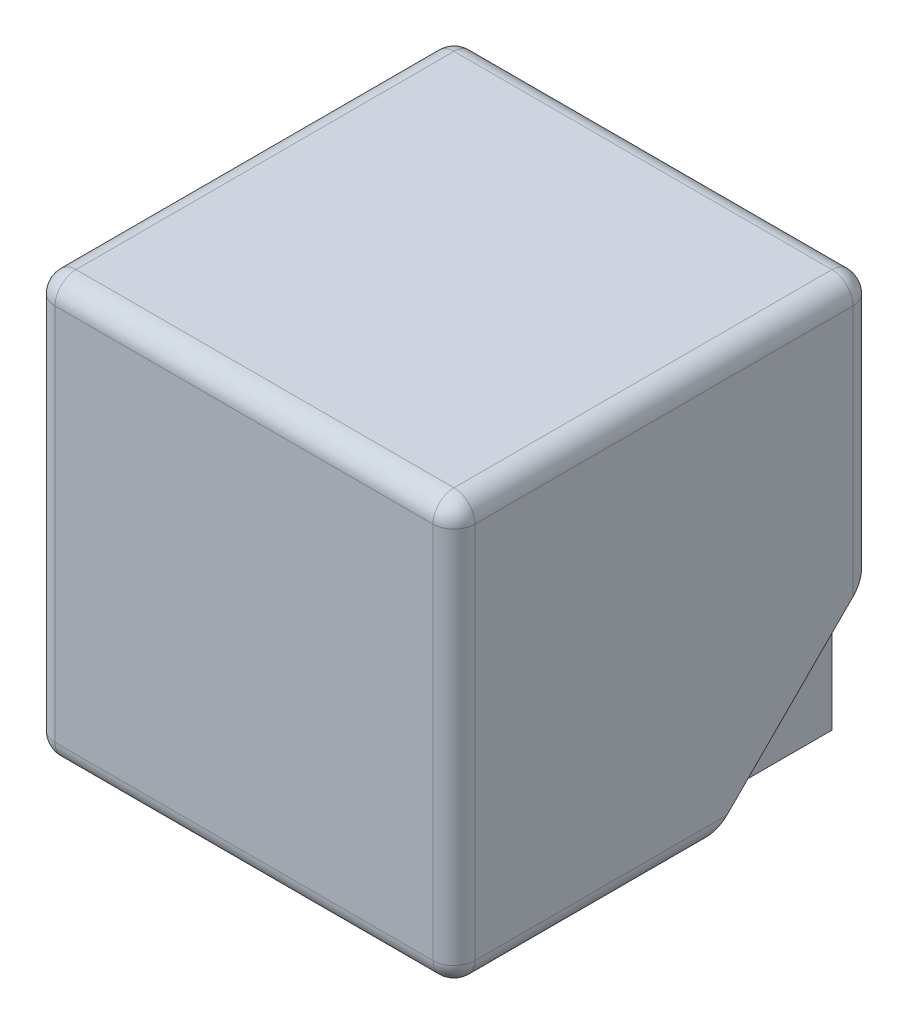
ISO-10303-21;
HEADER;
FILE_DESCRIPTION(('STEP AP214'),'2;1');
FILE_NAME('part.step','',(''),(''),'','','');
FILE_SCHEMA(('AUTOMOTIVE_DESIGN { 1 0 10303 214 1 1 1 1 }'));
ENDSEC;
DATA;
#1=APPLICATION_CONTEXT('core data for automotive mechanical design processes');
#2=APPLICATION_PROTOCOL_DEFINITION('international standard','automotive_design',2000,#1);
#3=PRODUCT_CONTEXT('',#1,'mechanical');
#4=PRODUCT('Part','Part','',(#3));
#5=PRODUCT_RELATED_PRODUCT_CATEGORY('part','',(#4));
#6=PRODUCT_DEFINITION_FORMATION('','',#4);
#7=PRODUCT_DEFINITION_CONTEXT('part definition',#1,'design');
#8=PRODUCT_DEFINITION('design','',#6,#7);
#9=PRODUCT_DEFINITION_SHAPE('','',#8);
#10=(LENGTH_UNIT() NAMED_UNIT(*) SI_UNIT(.MILLI.,.METRE.));
#11=(NAMED_UNIT(*) PLANE_ANGLE_UNIT() SI_UNIT($,.RADIAN.));
#12=(NAMED_UNIT(*) SI_UNIT($,.STERADIAN.) SOLID_ANGLE_UNIT());
#13=UNCERTAINTY_MEASURE_WITH_UNIT(LENGTH_MEASURE(1.E-05),#10,'distance_accuracy_value','');
#14=(GEOMETRIC_REPRESENTATION_CONTEXT(3) GLOBAL_UNCERTAINTY_ASSIGNED_CONTEXT((#13)) GLOBAL_UNIT_ASSIGNED_CONTEXT((#10,
#11,#12)) REPRESENTATION_CONTEXT('',''));
#15=CARTESIAN_POINT('',(0.,0.,0.));
#16=DIRECTION('',(0.,0.,1.));
#17=DIRECTION('',(1.,0.,0.));
#18=AXIS2_PLACEMENT_3D('',#15,#16,#17);
#19=CARTESIAN_POINT('',(-5.,-5.,10.));
#20=DIRECTION('',(1.,0.,0.));
#21=DIRECTION('',(0.,1.,0.));
#22=AXIS2_PLACEMENT_3D('',#19,#20,#21);
#23=PLANE('',#22);
#24=DIRECTION('',(0.,0.,-1.));
#25=VECTOR('',#24,1.);
#26=CARTESIAN_POINT('',(-5.,4.5,10.));
#27=LINE('',#26,#25);
#28=CARTESIAN_POINT('',(-5.,4.5,9.5));
#29=VERTEX_POINT('',#28);
#30=CARTESIAN_POINT('',(-5.,4.5,0.5));
#31=VERTEX_POINT('',#30);
#32=EDGE_CURVE('E262',#29,#31,#27,.T.);
#33=ORIENTED_EDGE('',*,*,#32,.T.);
#34=DIRECTION('',(0.,-1.,0.));
#35=VECTOR('',#34,1.);
#36=CARTESIAN_POINT('',(-5.,-0.999999999999985,0.5));
#37=LINE('',#36,#35);
#38=CARTESIAN_POINT('',(-5.,-1.49999999999999,0.500000000000001));
#39=VERTEX_POINT('',#38);
#40=EDGE_CURVE('E57',#31,#39,#37,.T.);
#41=ORIENTED_EDGE('',*,*,#40,.T.);
#42=DIRECTION('',(0.,-0.707106781186549,0.707106781186546));
#43=VECTOR('',#42,1.);
#44=CARTESIAN_POINT('',(-5.,-5.,4.));
#45=LINE('',#44,#43);
#46=CARTESIAN_POINT('',(-5.,-4.5,3.5));
#47=VERTEX_POINT('',#46);
#48=EDGE_CURVE('E282',#39,#47,#45,.T.);
#49=ORIENTED_EDGE('',*,*,#48,.T.);
#50=DIRECTION('',(0.,0.,-1.));
#51=VECTOR('',#50,1.);
#52=CARTESIAN_POINT('',(-5.,-4.5,10.));
#53=LINE('',#52,#51);
#54=CARTESIAN_POINT('',(-5.,-4.5,9.5));
#55=VERTEX_POINT('',#54);
#56=EDGE_CURVE('E324',#47,#55,#53,.F.);
#57=ORIENTED_EDGE('',*,*,#56,.T.);
#58=DIRECTION('',(0.,-1.,0.));
#59=VECTOR('',#58,1.);
#60=CARTESIAN_POINT('',(-5.,-5.,9.5));
#61=LINE('',#60,#59);
#62=EDGE_CURVE('E264',#55,#29,#61,.F.);
#63=ORIENTED_EDGE('',*,*,#62,.T.);
#64=EDGE_LOOP('',(#33,#41,#49,#57,#63));
#65=FACE_BOUND('',#64,.T.);
#66=ADVANCED_FACE('F37',(#65),#23,.F.);
#67=CARTESIAN_POINT('',(-5.,-5.,10.));
#68=DIRECTION('',(0.,1.,0.));
#69=DIRECTION('',(0.,0.,1.));
#70=AXIS2_PLACEMENT_3D('',#67,#68,#69);
#71=PLANE('',#70);
#72=DIRECTION('',(1.,0.,0.));
#73=VECTOR('',#72,1.);
#74=CARTESIAN_POINT('',(5.,-5.,4.));
#75=LINE('',#74,#73);
#76=CARTESIAN_POINT('',(2.,-5.,4.));
#77=VERTEX_POINT('',#76);
#78=CARTESIAN_POINT('',(4.5,-5.,4.));
#79=VERTEX_POINT('',#78);
#80=EDGE_CURVE('E271',#77,#79,#75,.T.);
#81=ORIENTED_EDGE('',*,*,#80,.T.);
#82=DIRECTION('',(0.,0.,-1.));
#83=VECTOR('',#82,1.);
#84=CARTESIAN_POINT('',(4.5,-5.,10.));
#85=LINE('',#84,#83);
#86=CARTESIAN_POINT('',(4.5,-5.,9.5));
#87=VERTEX_POINT('',#86);
#88=EDGE_CURVE('E318',#79,#87,#85,.F.);
#89=ORIENTED_EDGE('',*,*,#88,.T.);
#90=DIRECTION('',(1.,0.,0.));
#91=VECTOR('',#90,1.);
#92=CARTESIAN_POINT('',(-5.,-5.,9.5));
#93=LINE('',#92,#91);
#94=CARTESIAN_POINT('',(-4.5,-5.,9.5));
#95=VERTEX_POINT('',#94);
#96=EDGE_CURVE('E243',#87,#95,#93,.F.);
#97=ORIENTED_EDGE('',*,*,#96,.T.);
#98=DIRECTION('',(0.,0.,-1.));
#99=VECTOR('',#98,1.);
#100=CARTESIAN_POINT('',(-4.5,-5.,10.));
#101=LINE('',#100,#99);
#102=CARTESIAN_POINT('',(-4.5,-5.,4.));
#103=VERTEX_POINT('',#102);
#104=EDGE_CURVE('E316',#95,#103,#101,.T.);
#105=ORIENTED_EDGE('',*,*,#104,.T.);
#106=DIRECTION('',(1.,0.,0.));
#107=VECTOR('',#106,1.);
#108=CARTESIAN_POINT('',(-2.,-5.,4.));
#109=LINE('',#108,#107);
#110=CARTESIAN_POINT('',(-2.,-5.,4.));
#111=VERTEX_POINT('',#110);
#112=EDGE_CURVE('E269',#103,#111,#109,.T.);
#113=ORIENTED_EDGE('',*,*,#112,.T.);
#114=DIRECTION('',(0.,0.,-1.));
#115=VECTOR('',#114,1.);
#116=CARTESIAN_POINT('',(-2.,-5.,10.));
#117=LINE('',#116,#115);
#118=CARTESIAN_POINT('',(-2.,-5.,5.));
#119=VERTEX_POINT('',#118);
#120=EDGE_CURVE('E193',#119,#111,#117,.T.);
#121=ORIENTED_EDGE('',*,*,#120,.F.);
#122=DIRECTION('',(-1.,0.,0.));
#123=VECTOR('',#122,1.);
#124=CARTESIAN_POINT('',(-5.,-5.,5.));
#125=LINE('',#124,#123);
#126=CARTESIAN_POINT('',(2.,-5.,5.));
#127=VERTEX_POINT('',#126);
#128=EDGE_CURVE('E179',#127,#119,#125,.T.);
#129=ORIENTED_EDGE('',*,*,#128,.F.);
#130=DIRECTION('',(0.,0.,-1.));
#131=VECTOR('',#130,1.);
#132=CARTESIAN_POINT('',(2.,-5.,10.));
#133=LINE('',#132,#131);
#134=EDGE_CURVE('E220',#127,#77,#133,.T.);
#135=ORIENTED_EDGE('',*,*,#134,.T.);
#136=EDGE_LOOP('',(#81,#89,#97,#105,#113,#121,#129,#135));
#137=FACE_BOUND('',#136,.T.);
#138=ADVANCED_FACE('F399',(#137),#71,.F.);
#139=CARTESIAN_POINT('',(5.,-5.,10.));
#140=DIRECTION('',(-1.,0.,0.));
#141=DIRECTION('',(0.,-1.,0.));
#142=AXIS2_PLACEMENT_3D('',#139,#140,#141);
#143=PLANE('',#142);
#144=DIRECTION('',(0.,1.,0.));
#145=VECTOR('',#144,1.);
#146=CARTESIAN_POINT('',(5.,-5.,9.5));
#147=LINE('',#146,#145);
#148=CARTESIAN_POINT('',(5.,4.5,9.5));
#149=VERTEX_POINT('',#148);
#150=CARTESIAN_POINT('',(5.,-4.5,9.5));
#151=VERTEX_POINT('',#150);
#152=EDGE_CURVE('E248',#149,#151,#147,.F.);
#153=ORIENTED_EDGE('',*,*,#152,.T.);
#154=DIRECTION('',(0.,0.,-1.));
#155=VECTOR('',#154,1.);
#156=CARTESIAN_POINT('',(5.,-4.5,10.));
#157=LINE('',#156,#155);
#158=CARTESIAN_POINT('',(5.,-4.5,3.5));
#159=VERTEX_POINT('',#158);
#160=EDGE_CURVE('E310',#151,#159,#157,.T.);
#161=ORIENTED_EDGE('',*,*,#160,.T.);
#162=DIRECTION('',(0.,0.707106781186549,-0.707106781186546));
#163=VECTOR('',#162,1.);
#164=CARTESIAN_POINT('',(5.,-5.,4.));
#165=LINE('',#164,#163);
#166=CARTESIAN_POINT('',(5.,-1.49999999999999,0.5));
#167=VERTEX_POINT('',#166);
#168=EDGE_CURVE('E274',#159,#167,#165,.T.);
#169=ORIENTED_EDGE('',*,*,#168,.T.);
#170=DIRECTION('',(0.,1.,0.));
#171=VECTOR('',#170,1.);
#172=CARTESIAN_POINT('',(5.,4.5,0.5));
#173=LINE('',#172,#171);
#174=CARTESIAN_POINT('',(5.,4.5,0.5));
#175=VERTEX_POINT('',#174);
#176=EDGE_CURVE('E308',#167,#175,#173,.T.);
#177=ORIENTED_EDGE('',*,*,#176,.T.);
#178=DIRECTION('',(0.,0.,-1.));
#179=VECTOR('',#178,1.);
#180=CARTESIAN_POINT('',(5.,4.5,10.));
#181=LINE('',#180,#179);
#182=EDGE_CURVE('E246',#175,#149,#181,.F.);
#183=ORIENTED_EDGE('',*,*,#182,.T.);
#184=EDGE_LOOP('',(#153,#161,#169,#177,#183));
#185=FACE_BOUND('',#184,.T.);
#186=ADVANCED_FACE('F419',(#185),#143,.F.);
#187=CARTESIAN_POINT('',(-5.,5.,10.));
#188=DIRECTION('',(0.,-1.,0.));
#189=DIRECTION('',(0.,0.,-1.));
#190=AXIS2_PLACEMENT_3D('',#187,#188,#189);
#191=PLANE('',#190);
#192=DIRECTION('',(0.,0.,-1.));
#193=VECTOR('',#192,1.);
#194=CARTESIAN_POINT('',(-4.5,5.,10.));
#195=LINE('',#194,#193);
#196=CARTESIAN_POINT('',(-4.5,5.,0.5));
#197=VERTEX_POINT('',#196);
#198=CARTESIAN_POINT('',(-4.5,5.,9.5));
#199=VERTEX_POINT('',#198);
#200=EDGE_CURVE('E254',#197,#199,#195,.F.);
#201=ORIENTED_EDGE('',*,*,#200,.T.);
#202=DIRECTION('',(-1.,0.,0.));
#203=VECTOR('',#202,1.);
#204=CARTESIAN_POINT('',(-5.,5.,9.5));
#205=LINE('',#204,#203);
#206=CARTESIAN_POINT('',(4.5,5.,9.5));
#207=VERTEX_POINT('',#206);
#208=EDGE_CURVE('E259',#199,#207,#205,.F.);
#209=ORIENTED_EDGE('',*,*,#208,.T.);
#210=DIRECTION('',(0.,0.,-1.));
#211=VECTOR('',#210,1.);
#212=CARTESIAN_POINT('',(4.5,5.,10.));
#213=LINE('',#212,#211);
#214=CARTESIAN_POINT('',(4.5,5.,0.5));
#215=VERTEX_POINT('',#214);
#216=EDGE_CURVE('E256',#207,#215,#213,.T.);
#217=ORIENTED_EDGE('',*,*,#216,.T.);
#218=DIRECTION('',(-1.,0.,0.));
#219=VECTOR('',#218,1.);
#220=CARTESIAN_POINT('',(-5.,5.,0.5));
#221=LINE('',#220,#219);
#222=EDGE_CURVE('E251',#215,#197,#221,.T.);
#223=ORIENTED_EDGE('',*,*,#222,.T.);
#224=EDGE_LOOP('',(#201,#209,#217,#223));
#225=FACE_BOUND('',#224,.T.);
#226=ADVANCED_FACE('F439',(#225),#191,.F.);
#227=CARTESIAN_POINT('',(-5.,5.,10.));
#228=DIRECTION('',(0.,0.,-1.));
#229=DIRECTION('',(-1.,0.,0.));
#230=AXIS2_PLACEMENT_3D('',#227,#228,#229);
#231=PLANE('',#230);
#232=DIRECTION('',(0.,-1.,0.));
#233=VECTOR('',#232,1.);
#234=CARTESIAN_POINT('',(-4.5,5.,10.));
#235=LINE('',#234,#233);
#236=CARTESIAN_POINT('',(-4.5,4.5,10.));
#237=VERTEX_POINT('',#236);
#238=CARTESIAN_POINT('',(-4.5,-4.5,10.));
#239=VERTEX_POINT('',#238);
#240=EDGE_CURVE('E233',#237,#239,#235,.T.);
#241=ORIENTED_EDGE('',*,*,#240,.T.);
#242=DIRECTION('',(1.,0.,0.));
#243=VECTOR('',#242,1.);
#244=CARTESIAN_POINT('',(-5.,-4.5,10.));
#245=LINE('',#244,#243);
#246=CARTESIAN_POINT('',(4.5,-4.5,10.));
#247=VERTEX_POINT('',#246);
#248=EDGE_CURVE('E240',#239,#247,#245,.T.);
#249=ORIENTED_EDGE('',*,*,#248,.T.);
#250=DIRECTION('',(0.,1.,0.));
#251=VECTOR('',#250,1.);
#252=CARTESIAN_POINT('',(4.5,5.,10.));
#253=LINE('',#252,#251);
#254=CARTESIAN_POINT('',(4.5,4.5,10.));
#255=VERTEX_POINT('',#254);
#256=EDGE_CURVE('E238',#247,#255,#253,.T.);
#257=ORIENTED_EDGE('',*,*,#256,.T.);
#258=DIRECTION('',(-1.,0.,0.));
#259=VECTOR('',#258,1.);
#260=CARTESIAN_POINT('',(-5.,4.5,10.));
#261=LINE('',#260,#259);
#262=EDGE_CURVE('E236',#255,#237,#261,.T.);
#263=ORIENTED_EDGE('',*,*,#262,.T.);
#264=EDGE_LOOP('',(#241,#249,#257,#263));
#265=FACE_BOUND('',#264,.T.);
#266=ADVANCED_FACE('F437',(#265),#231,.F.);
#267=CARTESIAN_POINT('',(-5.,5.,0.));
#268=DIRECTION('',(0.,0.,-1.));
#269=DIRECTION('',(-1.,0.,0.));
#270=AXIS2_PLACEMENT_3D('',#267,#268,#269);
#271=PLANE('',#270);
#272=DIRECTION('',(-1.,0.,0.));
#273=VECTOR('',#272,1.);
#274=CARTESIAN_POINT('',(5.,4.5,0.));
#275=LINE('',#274,#273);
#276=CARTESIAN_POINT('',(-4.5,4.5,0.));
#277=VERTEX_POINT('',#276);
#278=CARTESIAN_POINT('',(4.5,4.5,0.));
#279=VERTEX_POINT('',#278);
#280=EDGE_CURVE('E266',#277,#279,#275,.F.);
#281=ORIENTED_EDGE('',*,*,#280,.T.);
#282=DIRECTION('',(0.,1.,0.));
#283=VECTOR('',#282,1.);
#284=CARTESIAN_POINT('',(4.5,-0.999999999999985,0.));
#285=LINE('',#284,#283);
#286=CARTESIAN_POINT('',(4.5,-0.999999999999985,0.));
#287=VERTEX_POINT('',#286);
#288=EDGE_CURVE('E322',#279,#287,#285,.F.);
#289=ORIENTED_EDGE('',*,*,#288,.T.);
#290=DIRECTION('',(-1.,0.,0.));
#291=VECTOR('',#290,1.);
#292=CARTESIAN_POINT('',(2.,-0.999999999999985,0.));
#293=LINE('',#292,#291);
#294=CARTESIAN_POINT('',(2.,-0.999999999999985,0.));
#295=VERTEX_POINT('',#294);
#296=EDGE_CURVE('E280',#287,#295,#293,.T.);
#297=ORIENTED_EDGE('',*,*,#296,.T.);
#298=DIRECTION('',(0.,-1.,0.));
#299=VECTOR('',#298,1.);
#300=CARTESIAN_POINT('',(2.,5.,0.));
#301=LINE('',#300,#299);
#302=CARTESIAN_POINT('',(2.,0.,0.));
#303=VERTEX_POINT('',#302);
#304=EDGE_CURVE('E229',#303,#295,#301,.T.);
#305=ORIENTED_EDGE('',*,*,#304,.F.);
#306=DIRECTION('',(-1.,0.,0.));
#307=VECTOR('',#306,1.);
#308=CARTESIAN_POINT('',(-5.,0.,0.));
#309=LINE('',#308,#307);
#310=CARTESIAN_POINT('',(-2.,0.,0.));
#311=VERTEX_POINT('',#310);
#312=EDGE_CURVE('E226',#303,#311,#309,.T.);
#313=ORIENTED_EDGE('',*,*,#312,.T.);
#314=DIRECTION('',(0.,-1.,0.));
#315=VECTOR('',#314,1.);
#316=CARTESIAN_POINT('',(-2.,5.,0.));
#317=LINE('',#316,#315);
#318=CARTESIAN_POINT('',(-2.,-0.999999999999985,0.));
#319=VERTEX_POINT('',#318);
#320=EDGE_CURVE('E223',#311,#319,#317,.T.);
#321=ORIENTED_EDGE('',*,*,#320,.T.);
#322=DIRECTION('',(-1.,0.,0.));
#323=VECTOR('',#322,1.);
#324=CARTESIAN_POINT('',(-5.,-0.999999999999985,0.));
#325=LINE('',#324,#323);
#326=CARTESIAN_POINT('',(-4.5,-0.999999999999985,0.));
#327=VERTEX_POINT('',#326);
#328=EDGE_CURVE('E277',#319,#327,#325,.T.);
#329=ORIENTED_EDGE('',*,*,#328,.T.);
#330=DIRECTION('',(0.,-1.,0.));
#331=VECTOR('',#330,1.);
#332=CARTESIAN_POINT('',(-4.5,4.5,0.));
#333=LINE('',#332,#331);
#334=EDGE_CURVE('E320',#327,#277,#333,.F.);
#335=ORIENTED_EDGE('',*,*,#334,.T.);
#336=EDGE_LOOP('',(#281,#289,#297,#305,#313,#321,#329,#335));
#337=FACE_BOUND('',#336,.T.);
#338=ADVANCED_FACE('F386',(#337),#271,.T.);
#339=CARTESIAN_POINT('',(2.,0.,5.));
#340=DIRECTION('',(0.,0.,-1.));
#341=DIRECTION('',(-1.,0.,0.));
#342=AXIS2_PLACEMENT_3D('',#339,#340,#341);
#343=PLANE('',#342);
#344=DIRECTION('',(0.,-1.,0.));
#345=VECTOR('',#344,1.);
#346=CARTESIAN_POINT('',(2.,0.,5.));
#347=LINE('',#346,#345);
#348=CARTESIAN_POINT('',(2.,-7.,5.));
#349=VERTEX_POINT('',#348);
#350=EDGE_CURVE('E208',#127,#349,#347,.T.);
#351=ORIENTED_EDGE('',*,*,#350,.F.);
#352=ORIENTED_EDGE('',*,*,#128,.T.);
#353=DIRECTION('',(0.,-1.,0.));
#354=VECTOR('',#353,1.);
#355=CARTESIAN_POINT('',(-2.,0.,5.));
#356=LINE('',#355,#354);
#357=CARTESIAN_POINT('',(-2.,-7.,5.));
#358=VERTEX_POINT('',#357);
#359=EDGE_CURVE('E173',#119,#358,#356,.T.);
#360=ORIENTED_EDGE('',*,*,#359,.T.);
#361=DIRECTION('',(-1.,0.,0.));
#362=VECTOR('',#361,1.);
#363=CARTESIAN_POINT('',(2.,-7.,5.));
#364=LINE('',#363,#362);
#365=EDGE_CURVE('E177',#349,#358,#364,.T.);
#366=ORIENTED_EDGE('',*,*,#365,.F.);
#367=EDGE_LOOP('',(#351,#352,#360,#366));
#368=FACE_BOUND('',#367,.T.);
#369=ADVANCED_FACE('F176',(#368),#343,.F.);
#370=CARTESIAN_POINT('',(2.,-7.,5.));
#371=DIRECTION('',(1.,0.,0.));
#372=DIRECTION('',(0.,0.,-1.));
#373=AXIS2_PLACEMENT_3D('',#370,#371,#372);
#374=PLANE('',#373);
#375=ORIENTED_EDGE('',*,*,#134,.F.);
#376=ORIENTED_EDGE('',*,*,#350,.T.);
#377=DIRECTION('',(0.,0.,-1.));
#378=VECTOR('',#377,1.);
#379=CARTESIAN_POINT('',(2.,-7.,5.));
#380=LINE('',#379,#378);
#381=CARTESIAN_POINT('',(2.,-7.,-2.));
#382=VERTEX_POINT('',#381);
#383=EDGE_CURVE('E192',#349,#382,#380,.T.);
#384=ORIENTED_EDGE('',*,*,#383,.T.);
#385=DIRECTION('',(0.,1.,0.));
#386=VECTOR('',#385,1.);
#387=CARTESIAN_POINT('',(2.,0.,-2.));
#388=LINE('',#387,#386);
#389=CARTESIAN_POINT('',(2.,0.,-2.));
#390=VERTEX_POINT('',#389);
#391=EDGE_CURVE('E211',#382,#390,#388,.T.);
#392=ORIENTED_EDGE('',*,*,#391,.T.);
#393=DIRECTION('',(0.,0.,1.));
#394=VECTOR('',#393,1.);
#395=CARTESIAN_POINT('',(2.,0.,5.));
#396=LINE('',#395,#394);
#397=EDGE_CURVE('E213',#390,#303,#396,.T.);
#398=ORIENTED_EDGE('',*,*,#397,.T.);
#399=ORIENTED_EDGE('',*,*,#304,.T.);
#400=DIRECTION('',(0.,-0.707106781186549,0.707106781186546));
#401=VECTOR('',#400,1.);
#402=CARTESIAN_POINT('',(2.,-5.,4.));
#403=LINE('',#402,#401);
#404=EDGE_CURVE('E284',#295,#77,#403,.T.);
#405=ORIENTED_EDGE('',*,*,#404,.T.);
#406=EDGE_LOOP('',(#375,#376,#384,#392,#398,#399,#405));
#407=FACE_BOUND('',#406,.T.);
#408=ADVANCED_FACE('F397',(#407),#374,.T.);
#409=CARTESIAN_POINT('',(-2.,-7.,5.));
#410=DIRECTION('',(1.,0.,0.));
#411=DIRECTION('',(0.,0.,-1.));
#412=AXIS2_PLACEMENT_3D('',#409,#410,#411);
#413=PLANE('',#412);
#414=ORIENTED_EDGE('',*,*,#359,.F.);
#415=ORIENTED_EDGE('',*,*,#120,.T.);
#416=DIRECTION('',(0.,0.707106781186549,-0.707106781186546));
#417=VECTOR('',#416,1.);
#418=CARTESIAN_POINT('',(-2.,-6.5,5.5));
#419=LINE('',#418,#417);
#420=EDGE_CURVE('E286',#111,#319,#419,.T.);
#421=ORIENTED_EDGE('',*,*,#420,.T.);
#422=ORIENTED_EDGE('',*,*,#320,.F.);
#423=DIRECTION('',(0.,0.,1.));
#424=VECTOR('',#423,1.);
#425=CARTESIAN_POINT('',(-2.,0.,5.));
#426=LINE('',#425,#424);
#427=CARTESIAN_POINT('',(-2.,0.,-2.));
#428=VERTEX_POINT('',#427);
#429=EDGE_CURVE('E202',#428,#311,#426,.T.);
#430=ORIENTED_EDGE('',*,*,#429,.F.);
#431=DIRECTION('',(0.,1.,0.));
#432=VECTOR('',#431,1.);
#433=CARTESIAN_POINT('',(-2.,0.,-2.));
#434=LINE('',#433,#432);
#435=CARTESIAN_POINT('',(-2.,-7.,-2.));
#436=VERTEX_POINT('',#435);
#437=EDGE_CURVE('E200',#436,#428,#434,.T.);
#438=ORIENTED_EDGE('',*,*,#437,.F.);
#439=DIRECTION('',(0.,0.,-1.));
#440=VECTOR('',#439,1.);
#441=CARTESIAN_POINT('',(-2.,-7.,5.));
#442=LINE('',#441,#440);
#443=EDGE_CURVE('E184',#358,#436,#442,.T.);
#444=ORIENTED_EDGE('',*,*,#443,.F.);
#445=EDGE_LOOP('',(#414,#415,#421,#422,#430,#438,#444));
#446=FACE_BOUND('',#445,.T.);
#447=ADVANCED_FACE('F197',(#446),#413,.F.);
#448=CARTESIAN_POINT('',(2.,-7.,5.));
#449=DIRECTION('',(0.,1.,0.));
#450=DIRECTION('',(0.,0.,1.));
#451=AXIS2_PLACEMENT_3D('',#448,#449,#450);
#452=PLANE('',#451);
#453=ORIENTED_EDGE('',*,*,#365,.T.);
#454=ORIENTED_EDGE('',*,*,#443,.T.);
#455=DIRECTION('',(-1.,0.,0.));
#456=VECTOR('',#455,1.);
#457=CARTESIAN_POINT('',(2.,-7.,-2.));
#458=LINE('',#457,#456);
#459=EDGE_CURVE('E194',#382,#436,#458,.T.);
#460=ORIENTED_EDGE('',*,*,#459,.F.);
#461=ORIENTED_EDGE('',*,*,#383,.F.);
#462=EDGE_LOOP('',(#453,#454,#460,#461));
#463=FACE_BOUND('',#462,.T.);
#464=ADVANCED_FACE('F190',(#463),#452,.F.);
#465=CARTESIAN_POINT('',(2.,0.,-2.));
#466=DIRECTION('',(0.,0.,1.));
#467=DIRECTION('',(1.,0.,0.));
#468=AXIS2_PLACEMENT_3D('',#465,#466,#467);
#469=PLANE('',#468);
#470=ORIENTED_EDGE('',*,*,#459,.T.);
#471=ORIENTED_EDGE('',*,*,#437,.T.);
#472=DIRECTION('',(-1.,0.,0.));
#473=VECTOR('',#472,1.);
#474=CARTESIAN_POINT('',(2.,0.,-2.));
#475=LINE('',#474,#473);
#476=EDGE_CURVE('E216',#390,#428,#475,.T.);
#477=ORIENTED_EDGE('',*,*,#476,.F.);
#478=ORIENTED_EDGE('',*,*,#391,.F.);
#479=EDGE_LOOP('',(#470,#471,#477,#478));
#480=FACE_BOUND('',#479,.T.);
#481=ADVANCED_FACE('F395',(#480),#469,.F.);
#482=CARTESIAN_POINT('',(2.,0.,5.));
#483=DIRECTION('',(0.,-1.,0.));
#484=DIRECTION('',(0.,0.,-1.));
#485=AXIS2_PLACEMENT_3D('',#482,#483,#484);
#486=PLANE('',#485);
#487=ORIENTED_EDGE('',*,*,#312,.F.);
#488=ORIENTED_EDGE('',*,*,#397,.F.);
#489=ORIENTED_EDGE('',*,*,#476,.T.);
#490=ORIENTED_EDGE('',*,*,#429,.T.);
#491=EDGE_LOOP('',(#487,#488,#489,#490));
#492=FACE_BOUND('',#491,.T.);
#493=ADVANCED_FACE('F390',(#492),#486,.F.);
#494=CARTESIAN_POINT('',(-5.,4.5,0.5));
#495=DIRECTION('',(1.,0.,0.));
#496=DIRECTION('',(0.,0.,-1.));
#497=AXIS2_PLACEMENT_3D('',#494,#495,#496);
#498=CYLINDRICAL_SURFACE('',#497,0.5);
#499=ORIENTED_EDGE('',*,*,#222,.F.);
#500=CARTESIAN_POINT('',(4.5,4.5,0.5));
#501=DIRECTION('',(1.,0.,0.));
#502=DIRECTION('',(0.,0.,-1.));
#503=AXIS2_PLACEMENT_3D('',#500,#501,#502);
#504=CIRCLE('',#503,0.5);
#505=EDGE_CURVE('E301',#215,#279,#504,.F.);
#506=ORIENTED_EDGE('',*,*,#505,.T.);
#507=ORIENTED_EDGE('',*,*,#280,.F.);
#508=CARTESIAN_POINT('',(-4.5,4.5,0.5));
#509=DIRECTION('',(1.,0.,0.));
#510=DIRECTION('',(0.,0.,-1.));
#511=AXIS2_PLACEMENT_3D('',#508,#509,#510);
#512=CIRCLE('',#511,0.5);
#513=EDGE_CURVE('E299',#277,#197,#512,.T.);
#514=ORIENTED_EDGE('',*,*,#513,.T.);
#515=EDGE_LOOP('',(#499,#506,#507,#514));
#516=FACE_BOUND('',#515,.T.);
#517=ADVANCED_FACE('F521',(#516),#498,.T.);
#518=CARTESIAN_POINT('',(-4.5,4.5,10.));
#519=DIRECTION('',(0.,0.,-1.));
#520=DIRECTION('',(-1.,0.,0.));
#521=AXIS2_PLACEMENT_3D('',#518,#519,#520);
#522=CYLINDRICAL_SURFACE('',#521,0.5);
#523=ORIENTED_EDGE('',*,*,#200,.F.);
#524=CARTESIAN_POINT('',(-4.5,4.5,0.5));
#525=DIRECTION('',(0.,0.,-1.));
#526=DIRECTION('',(-1.,0.,0.));
#527=AXIS2_PLACEMENT_3D('',#524,#525,#526);
#528=CIRCLE('',#527,0.5);
#529=EDGE_CURVE('E303',#197,#31,#528,.F.);
#530=ORIENTED_EDGE('',*,*,#529,.T.);
#531=ORIENTED_EDGE('',*,*,#32,.F.);
#532=CARTESIAN_POINT('',(-4.5,4.5,9.5));
#533=DIRECTION('',(0.,0.,1.));
#534=DIRECTION('',(1.,0.,0.));
#535=AXIS2_PLACEMENT_3D('',#532,#533,#534);
#536=CIRCLE('',#535,0.5);
#537=EDGE_CURVE('E185',#199,#29,#536,.T.);
#538=ORIENTED_EDGE('',*,*,#537,.F.);
#539=EDGE_LOOP('',(#523,#530,#531,#538));
#540=FACE_BOUND('',#539,.T.);
#541=ADVANCED_FACE('F372',(#540),#522,.T.);
#542=CARTESIAN_POINT('',(-5.,4.5,9.5));
#543=DIRECTION('',(-1.,0.,0.));
#544=DIRECTION('',(0.,0.,1.));
#545=AXIS2_PLACEMENT_3D('',#542,#543,#544);
#546=CYLINDRICAL_SURFACE('',#545,0.5);
#547=CARTESIAN_POINT('',(4.5,4.5,9.5));
#548=DIRECTION('',(1.,0.,0.));
#549=DIRECTION('',(0.,0.,-1.));
#550=AXIS2_PLACEMENT_3D('',#547,#548,#549);
#551=CIRCLE('',#550,0.5);
#552=EDGE_CURVE('E360',#207,#255,#551,.T.);
#553=ORIENTED_EDGE('',*,*,#552,.F.);
#554=ORIENTED_EDGE('',*,*,#208,.F.);
#555=CARTESIAN_POINT('',(-4.5,4.5,9.5));
#556=DIRECTION('',(-1.,0.,0.));
#557=DIRECTION('',(0.,0.,1.));
#558=AXIS2_PLACEMENT_3D('',#555,#556,#557);
#559=CIRCLE('',#558,0.5);
#560=EDGE_CURVE('E363',#237,#199,#559,.T.);
#561=ORIENTED_EDGE('',*,*,#560,.F.);
#562=ORIENTED_EDGE('',*,*,#262,.F.);
#563=EDGE_LOOP('',(#553,#554,#561,#562));
#564=FACE_BOUND('',#563,.T.);
#565=ADVANCED_FACE('F435',(#564),#546,.T.);
#566=CARTESIAN_POINT('',(4.5,4.5,10.));
#567=DIRECTION('',(0.,0.,-1.));
#568=DIRECTION('',(-1.,0.,0.));
#569=AXIS2_PLACEMENT_3D('',#566,#567,#568);
#570=CYLINDRICAL_SURFACE('',#569,0.5);
#571=ORIENTED_EDGE('',*,*,#182,.F.);
#572=CARTESIAN_POINT('',(4.5,4.5,0.5));
#573=DIRECTION('',(0.,0.,-1.));
#574=DIRECTION('',(-1.,0.,0.));
#575=AXIS2_PLACEMENT_3D('',#572,#573,#574);
#576=CIRCLE('',#575,0.5);
#577=EDGE_CURVE('E296',#175,#215,#576,.F.);
#578=ORIENTED_EDGE('',*,*,#577,.T.);
#579=ORIENTED_EDGE('',*,*,#216,.F.);
#580=CARTESIAN_POINT('',(4.5,4.5,9.5));
#581=DIRECTION('',(0.,0.,1.));
#582=DIRECTION('',(1.,0.,0.));
#583=AXIS2_PLACEMENT_3D('',#580,#581,#582);
#584=CIRCLE('',#583,0.5);
#585=EDGE_CURVE('E358',#149,#207,#584,.T.);
#586=ORIENTED_EDGE('',*,*,#585,.F.);
#587=EDGE_LOOP('',(#571,#578,#579,#586));
#588=FACE_BOUND('',#587,.T.);
#589=ADVANCED_FACE('F428',(#588),#570,.T.);
#590=CARTESIAN_POINT('',(-4.5,4.5,9.5));
#591=DIRECTION('',(0.,0.,1.));
#592=DIRECTION('',(1.,0.,0.));
#593=AXIS2_PLACEMENT_3D('',#590,#591,#592);
#594=SPHERICAL_SURFACE('',#593,0.5);
#595=ORIENTED_EDGE('',*,*,#560,.T.);
#596=ORIENTED_EDGE('',*,*,#537,.T.);
#597=CARTESIAN_POINT('',(-4.5,4.5,9.5));
#598=DIRECTION('',(0.,1.,0.));
#599=DIRECTION('',(0.,0.,1.));
#600=AXIS2_PLACEMENT_3D('',#597,#598,#599);
#601=CIRCLE('',#600,0.5);
#602=EDGE_CURVE('E337',#237,#29,#601,.F.);
#603=ORIENTED_EDGE('',*,*,#602,.F.);
#604=EDGE_LOOP('',(#595,#596,#603));
#605=FACE_BOUND('',#604,.T.);
#606=ADVANCED_FACE('F368',(#605),#594,.T.);
#607=CARTESIAN_POINT('',(4.5,4.5,9.5));
#608=DIRECTION('',(0.,0.,1.));
#609=DIRECTION('',(1.,0.,0.));
#610=AXIS2_PLACEMENT_3D('',#607,#608,#609);
#611=SPHERICAL_SURFACE('',#610,0.5);
#612=ORIENTED_EDGE('',*,*,#585,.T.);
#613=ORIENTED_EDGE('',*,*,#552,.T.);
#614=CARTESIAN_POINT('',(4.5,4.5,9.5));
#615=DIRECTION('',(0.,1.,0.));
#616=DIRECTION('',(0.,0.,1.));
#617=AXIS2_PLACEMENT_3D('',#614,#615,#616);
#618=CIRCLE('',#617,0.5);
#619=EDGE_CURVE('E354',#149,#255,#618,.F.);
#620=ORIENTED_EDGE('',*,*,#619,.F.);
#621=EDGE_LOOP('',(#612,#613,#620));
#622=FACE_BOUND('',#621,.T.);
#623=ADVANCED_FACE('F431',(#622),#611,.T.);
#624=CARTESIAN_POINT('',(-4.5,5.,9.5));
#625=DIRECTION('',(0.,-1.,0.));
#626=DIRECTION('',(1.,0.,0.));
#627=AXIS2_PLACEMENT_3D('',#624,#625,#626);
#628=CYLINDRICAL_SURFACE('',#627,0.5);
#629=ORIENTED_EDGE('',*,*,#62,.F.);
#630=CARTESIAN_POINT('',(-4.5,-4.5,9.5));
#631=DIRECTION('',(0.,-1.,0.));
#632=DIRECTION('',(1.,0.,0.));
#633=AXIS2_PLACEMENT_3D('',#630,#631,#632);
#634=CIRCLE('',#633,0.5);
#635=EDGE_CURVE('E306',#55,#239,#634,.F.);
#636=ORIENTED_EDGE('',*,*,#635,.T.);
#637=ORIENTED_EDGE('',*,*,#240,.F.);
#638=ORIENTED_EDGE('',*,*,#602,.T.);
#639=EDGE_LOOP('',(#629,#636,#637,#638));
#640=FACE_BOUND('',#639,.T.);
#641=ADVANCED_FACE('F334',(#640),#628,.T.);
#642=CARTESIAN_POINT('',(4.5,5.,9.5));
#643=DIRECTION('',(0.,1.,0.));
#644=DIRECTION('',(-1.,0.,0.));
#645=AXIS2_PLACEMENT_3D('',#642,#643,#644);
#646=CYLINDRICAL_SURFACE('',#645,0.5);
#647=ORIENTED_EDGE('',*,*,#256,.F.);
#648=CARTESIAN_POINT('',(4.5,-4.5,9.5));
#649=DIRECTION('',(0.,1.,0.));
#650=DIRECTION('',(-1.,0.,0.));
#651=AXIS2_PLACEMENT_3D('',#648,#649,#650);
#652=CIRCLE('',#651,0.5);
#653=EDGE_CURVE('E294',#247,#151,#652,.T.);
#654=ORIENTED_EDGE('',*,*,#653,.T.);
#655=ORIENTED_EDGE('',*,*,#152,.F.);
#656=ORIENTED_EDGE('',*,*,#619,.T.);
#657=EDGE_LOOP('',(#647,#654,#655,#656));
#658=FACE_BOUND('',#657,.T.);
#659=ADVANCED_FACE('F417',(#658),#646,.T.);
#660=CARTESIAN_POINT('',(-5.,-4.5,9.5));
#661=DIRECTION('',(1.,0.,0.));
#662=DIRECTION('',(0.,0.,-1.));
#663=AXIS2_PLACEMENT_3D('',#660,#661,#662);
#664=CYLINDRICAL_SURFACE('',#663,0.5);
#665=ORIENTED_EDGE('',*,*,#96,.F.);
#666=CARTESIAN_POINT('',(4.5,-4.5,9.5));
#667=DIRECTION('',(1.,0.,0.));
#668=DIRECTION('',(0.,0.,-1.));
#669=AXIS2_PLACEMENT_3D('',#666,#667,#668);
#670=CIRCLE('',#669,0.5);
#671=EDGE_CURVE('E291',#87,#247,#670,.F.);
#672=ORIENTED_EDGE('',*,*,#671,.T.);
#673=ORIENTED_EDGE('',*,*,#248,.F.);
#674=CARTESIAN_POINT('',(-4.5,-4.5,9.5));
#675=DIRECTION('',(1.,0.,0.));
#676=DIRECTION('',(0.,0.,-1.));
#677=AXIS2_PLACEMENT_3D('',#674,#675,#676);
#678=CIRCLE('',#677,0.5);
#679=EDGE_CURVE('E288',#239,#95,#678,.T.);
#680=ORIENTED_EDGE('',*,*,#679,.T.);
#681=EDGE_LOOP('',(#665,#672,#673,#680));
#682=FACE_BOUND('',#681,.T.);
#683=ADVANCED_FACE('F405',(#682),#664,.T.);
#684=CARTESIAN_POINT('',(-5.,-5.,4.));
#685=DIRECTION('',(0.,-0.707106781186546,-0.707106781186549));
#686=DIRECTION('',(0.,0.707106781186549,-0.707106781186546));
#687=AXIS2_PLACEMENT_3D('',#684,#685,#686);
#688=PLANE('',#687);
#689=ORIENTED_EDGE('',*,*,#168,.F.);
#690=CARTESIAN_POINT('',(4.5,-4.5,3.5));
#691=DIRECTION('',(0.,-0.707106781186546,-0.707106781186549));
#692=DIRECTION('',(0.,0.707106781186549,-0.707106781186546));
#693=AXIS2_PLACEMENT_3D('',#690,#691,#692);
#694=ELLIPSE('',#693,0.707106781186546,0.5);
#695=EDGE_CURVE('E314',#159,#79,#694,.T.);
#696=ORIENTED_EDGE('',*,*,#695,.T.);
#697=ORIENTED_EDGE('',*,*,#80,.F.);
#698=ORIENTED_EDGE('',*,*,#404,.F.);
#699=ORIENTED_EDGE('',*,*,#296,.F.);
#700=CARTESIAN_POINT('',(4.5,-1.49999999999999,0.5));
#701=DIRECTION('',(0.,-0.707106781186546,-0.707106781186549));
#702=DIRECTION('',(0.,-0.707106781186549,0.707106781186546));
#703=AXIS2_PLACEMENT_3D('',#700,#701,#702);
#704=ELLIPSE('',#703,0.707106781186549,0.5);
#705=EDGE_CURVE('E312',#287,#167,#704,.T.);
#706=ORIENTED_EDGE('',*,*,#705,.T.);
#707=EDGE_LOOP('',(#689,#696,#697,#698,#699,#706));
#708=FACE_BOUND('',#707,.T.);
#709=ADVANCED_FACE('F595',(#708),#688,.T.);
#710=CARTESIAN_POINT('',(-5.,-5.,4.));
#711=DIRECTION('',(0.,-0.707106781186546,-0.707106781186549));
#712=DIRECTION('',(0.,0.707106781186549,-0.707106781186546));
#713=AXIS2_PLACEMENT_3D('',#710,#711,#712);
#714=PLANE('',#713);
#715=ORIENTED_EDGE('',*,*,#48,.F.);
#716=CARTESIAN_POINT('',(-4.5,-1.49999999999999,0.5));
#717=DIRECTION('',(0.,-0.707106781186546,-0.707106781186549));
#718=DIRECTION('',(0.,0.707106781186549,-0.707106781186546));
#719=AXIS2_PLACEMENT_3D('',#716,#717,#718);
#720=ELLIPSE('',#719,0.707106781186549,0.5);
#721=EDGE_CURVE('E11',#39,#327,#720,.T.);
#722=ORIENTED_EDGE('',*,*,#721,.T.);
#723=ORIENTED_EDGE('',*,*,#328,.F.);
#724=ORIENTED_EDGE('',*,*,#420,.F.);
#725=ORIENTED_EDGE('',*,*,#112,.F.);
#726=CARTESIAN_POINT('',(-4.5,-4.5,3.5));
#727=DIRECTION('',(0.,-0.707106781186546,-0.707106781186549));
#728=DIRECTION('',(0.,0.707106781186549,-0.707106781186546));
#729=AXIS2_PLACEMENT_3D('',#726,#727,#728);
#730=ELLIPSE('',#729,0.707106781186546,0.5);
#731=EDGE_CURVE('E44',#103,#47,#730,.T.);
#732=ORIENTED_EDGE('',*,*,#731,.T.);
#733=EDGE_LOOP('',(#715,#722,#723,#724,#725,#732));
#734=FACE_BOUND('',#733,.T.);
#735=ADVANCED_FACE('F383',(#734),#714,.T.);
#736=CARTESIAN_POINT('',(4.5,-4.5,10.));
#737=DIRECTION('',(0.,0.,-1.));
#738=DIRECTION('',(-1.,0.,0.));
#739=AXIS2_PLACEMENT_3D('',#736,#737,#738);
#740=CYLINDRICAL_SURFACE('',#739,0.5);
#741=ORIENTED_EDGE('',*,*,#695,.F.);
#742=ORIENTED_EDGE('',*,*,#160,.F.);
#743=CARTESIAN_POINT('',(4.5,-4.5,9.5));
#744=DIRECTION('',(0.,0.,1.));
#745=DIRECTION('',(1.,0.,0.));
#746=AXIS2_PLACEMENT_3D('',#743,#744,#745);
#747=CIRCLE('',#746,0.5);
#748=EDGE_CURVE('E351',#87,#151,#747,.T.);
#749=ORIENTED_EDGE('',*,*,#748,.F.);
#750=ORIENTED_EDGE('',*,*,#88,.F.);
#751=EDGE_LOOP('',(#741,#742,#749,#750));
#752=FACE_BOUND('',#751,.T.);
#753=ADVANCED_FACE('F412',(#752),#740,.T.);
#754=CARTESIAN_POINT('',(4.5,-4.5,9.5));
#755=DIRECTION('',(0.,0.,1.));
#756=DIRECTION('',(1.,0.,0.));
#757=AXIS2_PLACEMENT_3D('',#754,#755,#756);
#758=SPHERICAL_SURFACE('',#757,0.5);
#759=ORIENTED_EDGE('',*,*,#748,.T.);
#760=ORIENTED_EDGE('',*,*,#653,.F.);
#761=ORIENTED_EDGE('',*,*,#671,.F.);
#762=EDGE_LOOP('',(#759,#760,#761));
#763=FACE_BOUND('',#762,.T.);
#764=ADVANCED_FACE('F414',(#763),#758,.T.);
#765=CARTESIAN_POINT('',(4.5,-5.,0.5));
#766=DIRECTION('',(0.,-1.,0.));
#767=DIRECTION('',(1.,0.,0.));
#768=AXIS2_PLACEMENT_3D('',#765,#766,#767);
#769=CYLINDRICAL_SURFACE('',#768,0.5);
#770=ORIENTED_EDGE('',*,*,#705,.F.);
#771=ORIENTED_EDGE('',*,*,#288,.F.);
#772=CARTESIAN_POINT('',(4.5,4.5,0.5));
#773=DIRECTION('',(0.,1.,0.));
#774=DIRECTION('',(0.,0.,1.));
#775=AXIS2_PLACEMENT_3D('',#772,#773,#774);
#776=CIRCLE('',#775,0.5);
#777=EDGE_CURVE('E346',#175,#279,#776,.T.);
#778=ORIENTED_EDGE('',*,*,#777,.F.);
#779=ORIENTED_EDGE('',*,*,#176,.F.);
#780=EDGE_LOOP('',(#770,#771,#778,#779));
#781=FACE_BOUND('',#780,.T.);
#782=ADVANCED_FACE('F629',(#781),#769,.T.);
#783=CARTESIAN_POINT('',(4.5,4.5,0.5));
#784=DIRECTION('',(0.,0.,1.));
#785=DIRECTION('',(1.,0.,0.));
#786=AXIS2_PLACEMENT_3D('',#783,#784,#785);
#787=SPHERICAL_SURFACE('',#786,0.5);
#788=ORIENTED_EDGE('',*,*,#777,.T.);
#789=ORIENTED_EDGE('',*,*,#505,.F.);
#790=ORIENTED_EDGE('',*,*,#577,.F.);
#791=EDGE_LOOP('',(#788,#789,#790));
#792=FACE_BOUND('',#791,.T.);
#793=ADVANCED_FACE('F638',(#792),#787,.T.);
#794=CARTESIAN_POINT('',(-4.5,-5.,0.5));
#795=DIRECTION('',(0.,1.,0.));
#796=DIRECTION('',(-1.,0.,0.));
#797=AXIS2_PLACEMENT_3D('',#794,#795,#796);
#798=CYLINDRICAL_SURFACE('',#797,0.5);
#799=ORIENTED_EDGE('',*,*,#721,.F.);
#800=ORIENTED_EDGE('',*,*,#40,.F.);
#801=CARTESIAN_POINT('',(-4.5,4.5,0.5));
#802=DIRECTION('',(0.,1.,0.));
#803=DIRECTION('',(0.,0.,1.));
#804=AXIS2_PLACEMENT_3D('',#801,#802,#803);
#805=CIRCLE('',#804,0.5);
#806=EDGE_CURVE('E344',#277,#31,#805,.T.);
#807=ORIENTED_EDGE('',*,*,#806,.F.);
#808=ORIENTED_EDGE('',*,*,#334,.F.);
#809=EDGE_LOOP('',(#799,#800,#807,#808));
#810=FACE_BOUND('',#809,.T.);
#811=ADVANCED_FACE('F381',(#810),#798,.T.);
#812=CARTESIAN_POINT('',(-4.5,4.5,0.5));
#813=DIRECTION('',(0.,0.,1.));
#814=DIRECTION('',(1.,0.,0.));
#815=AXIS2_PLACEMENT_3D('',#812,#813,#814);
#816=SPHERICAL_SURFACE('',#815,0.5);
#817=ORIENTED_EDGE('',*,*,#529,.F.);
#818=ORIENTED_EDGE('',*,*,#513,.F.);
#819=ORIENTED_EDGE('',*,*,#806,.T.);
#820=EDGE_LOOP('',(#817,#818,#819));
#821=FACE_BOUND('',#820,.T.);
#822=ADVANCED_FACE('F376',(#821),#816,.T.);
#823=CARTESIAN_POINT('',(-4.5,-4.5,10.));
#824=DIRECTION('',(0.,0.,-1.));
#825=DIRECTION('',(-1.,0.,0.));
#826=AXIS2_PLACEMENT_3D('',#823,#824,#825);
#827=CYLINDRICAL_SURFACE('',#826,0.5);
#828=ORIENTED_EDGE('',*,*,#731,.F.);
#829=ORIENTED_EDGE('',*,*,#104,.F.);
#830=CARTESIAN_POINT('',(-4.5,-4.5,9.5));
#831=DIRECTION('',(0.,0.,1.));
#832=DIRECTION('',(1.,0.,0.));
#833=AXIS2_PLACEMENT_3D('',#830,#831,#832);
#834=CIRCLE('',#833,0.5);
#835=EDGE_CURVE('E341',#55,#95,#834,.T.);
#836=ORIENTED_EDGE('',*,*,#835,.F.);
#837=ORIENTED_EDGE('',*,*,#56,.F.);
#838=EDGE_LOOP('',(#828,#829,#836,#837));
#839=FACE_BOUND('',#838,.T.);
#840=ADVANCED_FACE('F343',(#839),#827,.T.);
#841=CARTESIAN_POINT('',(-4.5,-4.5,9.5));
#842=DIRECTION('',(0.,0.,1.));
#843=DIRECTION('',(1.,0.,0.));
#844=AXIS2_PLACEMENT_3D('',#841,#842,#843);
#845=SPHERICAL_SURFACE('',#844,0.5);
#846=ORIENTED_EDGE('',*,*,#679,.F.);
#847=ORIENTED_EDGE('',*,*,#635,.F.);
#848=ORIENTED_EDGE('',*,*,#835,.T.);
#849=EDGE_LOOP('',(#846,#847,#848));
#850=FACE_BOUND('',#849,.T.);
#851=ADVANCED_FACE('F340',(#850),#845,.T.);
#852=CLOSED_SHELL('',(#66,#138,#186,#226,#266,#338,#369,#408,#447,#464,#481,#493,#517,#541,#565,
#589,#606,#623,#641,#659,#683,#709,#735,#753,#764,#782,#793,#811,#822,#840,#851));
#853=MANIFOLD_SOLID_BREP('B2',#852);
#854=ADVANCED_BREP_SHAPE_REPRESENTATION('',(#18,#853),#14);
#855=SHAPE_DEFINITION_REPRESENTATION(#9,#854);
ENDSEC;
END-ISO-10303-21;
